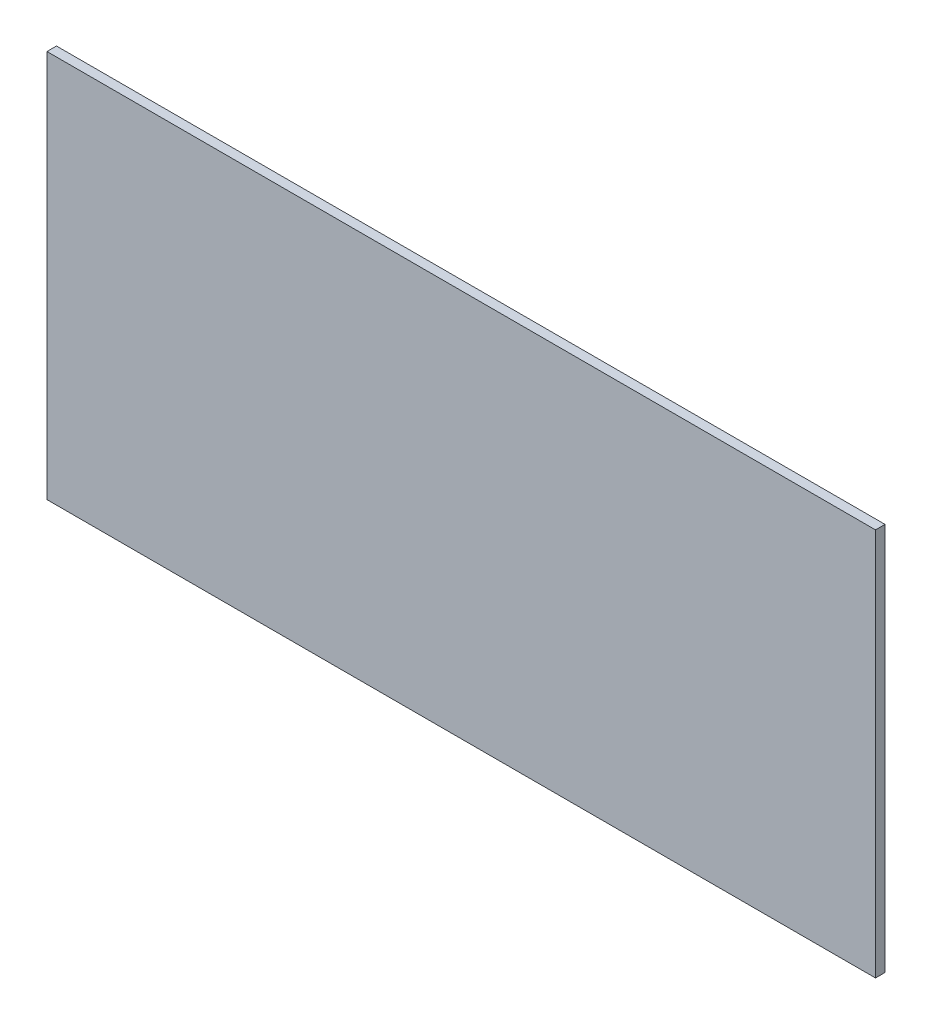
ISO-10303-21;
HEADER;
FILE_DESCRIPTION(('STEP AP214'),'2;1');
FILE_NAME('part.step','',(''),(''),'','','');
FILE_SCHEMA(('AUTOMOTIVE_DESIGN { 1 0 10303 214 1 1 1 1 }'));
ENDSEC;
DATA;
#1=APPLICATION_CONTEXT('core data for automotive mechanical design processes');
#2=APPLICATION_PROTOCOL_DEFINITION('international standard','automotive_design',2000,#1);
#3=PRODUCT_CONTEXT('',#1,'mechanical');
#4=PRODUCT('Part','Part','',(#3));
#5=PRODUCT_RELATED_PRODUCT_CATEGORY('part','',(#4));
#6=PRODUCT_DEFINITION_FORMATION('','',#4);
#7=PRODUCT_DEFINITION_CONTEXT('part definition',#1,'design');
#8=PRODUCT_DEFINITION('design','',#6,#7);
#9=PRODUCT_DEFINITION_SHAPE('','',#8);
#10=(LENGTH_UNIT() NAMED_UNIT(*) SI_UNIT(.MILLI.,.METRE.));
#11=(NAMED_UNIT(*) PLANE_ANGLE_UNIT() SI_UNIT($,.RADIAN.));
#12=(NAMED_UNIT(*) SI_UNIT($,.STERADIAN.) SOLID_ANGLE_UNIT());
#13=UNCERTAINTY_MEASURE_WITH_UNIT(LENGTH_MEASURE(1.E-05),#10,'distance_accuracy_value','');
#14=(GEOMETRIC_REPRESENTATION_CONTEXT(3) GLOBAL_UNCERTAINTY_ASSIGNED_CONTEXT((#13)) GLOBAL_UNIT_ASSIGNED_CONTEXT((#10,
#11,#12)) REPRESENTATION_CONTEXT('',''));
#15=CARTESIAN_POINT('',(0.,0.,0.));
#16=DIRECTION('',(0.,0.,1.));
#17=DIRECTION('',(1.,0.,0.));
#18=AXIS2_PLACEMENT_3D('',#15,#16,#17);
#19=CARTESIAN_POINT('',(174.,-81.5,4.));
#20=DIRECTION('',(-1.,0.,0.));
#21=DIRECTION('',(0.,0.,1.));
#22=AXIS2_PLACEMENT_3D('',#19,#20,#21);
#23=PLANE('',#22);
#24=DIRECTION('',(0.,1.,0.));
#25=VECTOR('',#24,1.);
#26=CARTESIAN_POINT('',(174.,-81.5,0.));
#27=LINE('',#26,#25);
#28=CARTESIAN_POINT('',(174.,-81.5,0.));
#29=VERTEX_POINT('',#28);
#30=CARTESIAN_POINT('',(174.,81.5,0.));
#31=VERTEX_POINT('',#30);
#32=EDGE_CURVE('E96',#29,#31,#27,.T.);
#33=ORIENTED_EDGE('',*,*,#32,.T.);
#34=DIRECTION('',(0.,0.,-1.));
#35=VECTOR('',#34,1.);
#36=CARTESIAN_POINT('',(174.,81.5,4.));
#37=LINE('',#36,#35);
#38=CARTESIAN_POINT('',(174.,81.5,4.));
#39=VERTEX_POINT('',#38);
#40=EDGE_CURVE('E11',#39,#31,#37,.T.);
#41=ORIENTED_EDGE('',*,*,#40,.F.);
#42=DIRECTION('',(0.,1.,0.));
#43=VECTOR('',#42,1.);
#44=CARTESIAN_POINT('',(174.,-81.5,4.));
#45=LINE('',#44,#43);
#46=CARTESIAN_POINT('',(174.,-81.5,4.));
#47=VERTEX_POINT('',#46);
#48=EDGE_CURVE('E84',#47,#39,#45,.T.);
#49=ORIENTED_EDGE('',*,*,#48,.F.);
#50=DIRECTION('',(0.,0.,-1.));
#51=VECTOR('',#50,1.);
#52=CARTESIAN_POINT('',(174.,-81.5,4.));
#53=LINE('',#52,#51);
#54=EDGE_CURVE('E92',#47,#29,#53,.T.);
#55=ORIENTED_EDGE('',*,*,#54,.T.);
#56=EDGE_LOOP('',(#33,#41,#49,#55));
#57=FACE_BOUND('',#56,.T.);
#58=ADVANCED_FACE('F33',(#57),#23,.F.);
#59=CARTESIAN_POINT('',(-174.,81.5,4.));
#60=DIRECTION('',(0.,-1.,0.));
#61=DIRECTION('',(0.,0.,-1.));
#62=AXIS2_PLACEMENT_3D('',#59,#60,#61);
#63=PLANE('',#62);
#64=DIRECTION('',(-1.,0.,0.));
#65=VECTOR('',#64,1.);
#66=CARTESIAN_POINT('',(-174.,81.5,0.));
#67=LINE('',#66,#65);
#68=CARTESIAN_POINT('',(-174.,81.5,0.));
#69=VERTEX_POINT('',#68);
#70=EDGE_CURVE('E88',#31,#69,#67,.T.);
#71=ORIENTED_EDGE('',*,*,#70,.T.);
#72=DIRECTION('',(0.,0.,-1.));
#73=VECTOR('',#72,1.);
#74=CARTESIAN_POINT('',(-174.,81.5,4.));
#75=LINE('',#74,#73);
#76=CARTESIAN_POINT('',(-174.,81.5,4.));
#77=VERTEX_POINT('',#76);
#78=EDGE_CURVE('E41',#77,#69,#75,.T.);
#79=ORIENTED_EDGE('',*,*,#78,.F.);
#80=DIRECTION('',(-1.,0.,0.));
#81=VECTOR('',#80,1.);
#82=CARTESIAN_POINT('',(-174.,81.5,4.));
#83=LINE('',#82,#81);
#84=EDGE_CURVE('E79',#39,#77,#83,.T.);
#85=ORIENTED_EDGE('',*,*,#84,.F.);
#86=ORIENTED_EDGE('',*,*,#40,.T.);
#87=EDGE_LOOP('',(#71,#79,#85,#86));
#88=FACE_BOUND('',#87,.T.);
#89=ADVANCED_FACE('F87',(#88),#63,.F.);
#90=CARTESIAN_POINT('',(-174.,-81.5,4.));
#91=DIRECTION('',(1.,0.,0.));
#92=DIRECTION('',(0.,0.,-1.));
#93=AXIS2_PLACEMENT_3D('',#90,#91,#92);
#94=PLANE('',#93);
#95=DIRECTION('',(0.,-1.,0.));
#96=VECTOR('',#95,1.);
#97=CARTESIAN_POINT('',(-174.,-81.5,0.));
#98=LINE('',#97,#96);
#99=CARTESIAN_POINT('',(-174.,-81.5,0.));
#100=VERTEX_POINT('',#99);
#101=EDGE_CURVE('E66',#69,#100,#98,.T.);
#102=ORIENTED_EDGE('',*,*,#101,.T.);
#103=DIRECTION('',(0.,0.,-1.));
#104=VECTOR('',#103,1.);
#105=CARTESIAN_POINT('',(-174.,-81.5,4.));
#106=LINE('',#105,#104);
#107=CARTESIAN_POINT('',(-174.,-81.5,4.));
#108=VERTEX_POINT('',#107);
#109=EDGE_CURVE('E89',#108,#100,#106,.T.);
#110=ORIENTED_EDGE('',*,*,#109,.F.);
#111=DIRECTION('',(0.,-1.,0.));
#112=VECTOR('',#111,1.);
#113=CARTESIAN_POINT('',(-174.,-81.5,4.));
#114=LINE('',#113,#112);
#115=EDGE_CURVE('E82',#77,#108,#114,.T.);
#116=ORIENTED_EDGE('',*,*,#115,.F.);
#117=ORIENTED_EDGE('',*,*,#78,.T.);
#118=EDGE_LOOP('',(#102,#110,#116,#117));
#119=FACE_BOUND('',#118,.T.);
#120=ADVANCED_FACE('F90',(#119),#94,.F.);
#121=CARTESIAN_POINT('',(-174.,-81.5,4.));
#122=DIRECTION('',(0.,1.,0.));
#123=DIRECTION('',(0.,0.,1.));
#124=AXIS2_PLACEMENT_3D('',#121,#122,#123);
#125=PLANE('',#124);
#126=DIRECTION('',(1.,0.,0.));
#127=VECTOR('',#126,1.);
#128=CARTESIAN_POINT('',(-174.,-81.5,0.));
#129=LINE('',#128,#127);
#130=EDGE_CURVE('E72',#100,#29,#129,.T.);
#131=ORIENTED_EDGE('',*,*,#130,.T.);
#132=ORIENTED_EDGE('',*,*,#54,.F.);
#133=DIRECTION('',(1.,0.,0.));
#134=VECTOR('',#133,1.);
#135=CARTESIAN_POINT('',(-174.,-81.5,4.));
#136=LINE('',#135,#134);
#137=EDGE_CURVE('E49',#108,#47,#136,.T.);
#138=ORIENTED_EDGE('',*,*,#137,.F.);
#139=ORIENTED_EDGE('',*,*,#109,.T.);
#140=EDGE_LOOP('',(#131,#132,#138,#139));
#141=FACE_BOUND('',#140,.T.);
#142=ADVANCED_FACE('F103',(#141),#125,.F.);
#143=CARTESIAN_POINT('',(0.,0.,4.));
#144=DIRECTION('',(0.,0.,-1.));
#145=DIRECTION('',(-1.,0.,0.));
#146=AXIS2_PLACEMENT_3D('',#143,#144,#145);
#147=PLANE('',#146);
#148=ORIENTED_EDGE('',*,*,#48,.T.);
#149=ORIENTED_EDGE('',*,*,#84,.T.);
#150=ORIENTED_EDGE('',*,*,#115,.T.);
#151=ORIENTED_EDGE('',*,*,#137,.T.);
#152=EDGE_LOOP('',(#148,#149,#150,#151));
#153=FACE_BOUND('',#152,.T.);
#154=ADVANCED_FACE('F80',(#153),#147,.F.);
#155=CARTESIAN_POINT('',(0.,0.,0.));
#156=DIRECTION('',(0.,0.,-1.));
#157=DIRECTION('',(-1.,0.,0.));
#158=AXIS2_PLACEMENT_3D('',#155,#156,#157);
#159=PLANE('',#158);
#160=ORIENTED_EDGE('',*,*,#32,.F.);
#161=ORIENTED_EDGE('',*,*,#130,.F.);
#162=ORIENTED_EDGE('',*,*,#101,.F.);
#163=ORIENTED_EDGE('',*,*,#70,.F.);
#164=EDGE_LOOP('',(#160,#161,#162,#163));
#165=FACE_BOUND('',#164,.T.);
#166=ADVANCED_FACE('F106',(#165),#159,.T.);
#167=CLOSED_SHELL('',(#58,#89,#120,#142,#154,#166));
#168=MANIFOLD_SOLID_BREP('B2',#167);
#169=ADVANCED_BREP_SHAPE_REPRESENTATION('',(#18,#168),#14);
#170=SHAPE_DEFINITION_REPRESENTATION(#9,#169);
ENDSEC;
END-ISO-10303-21;
